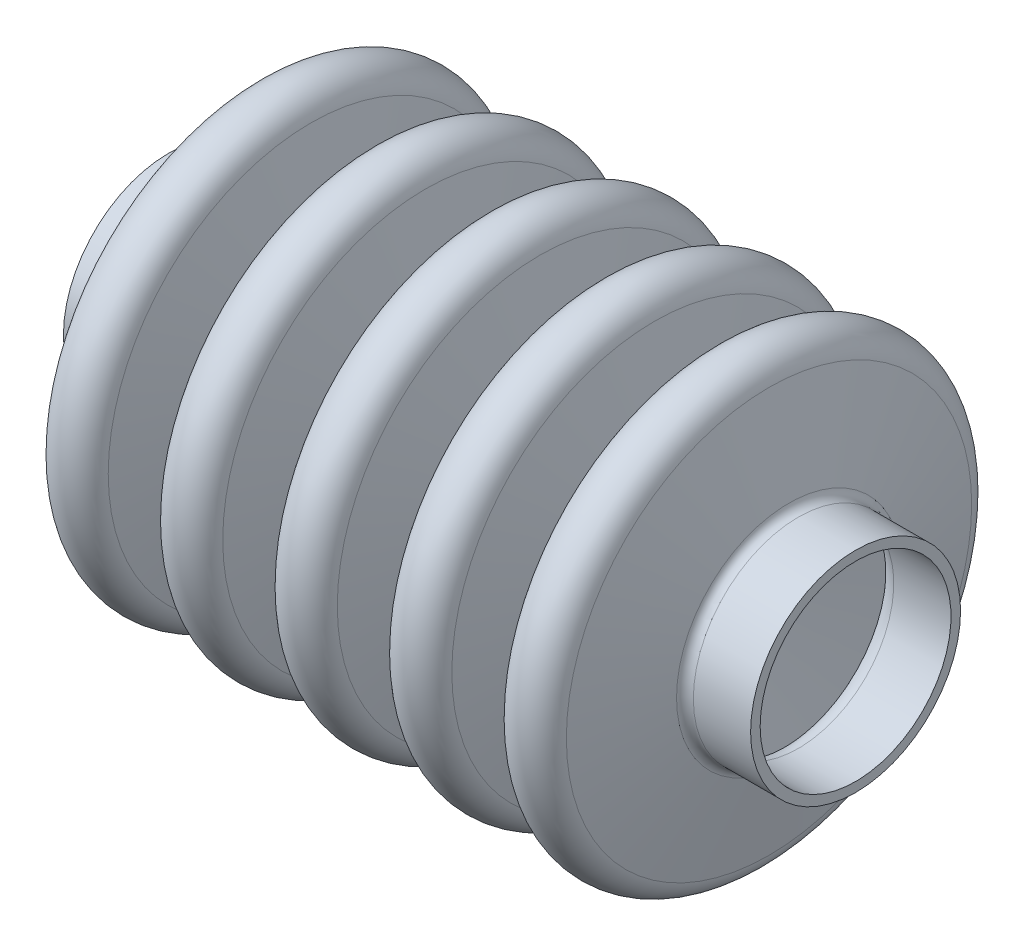
ISO-10303-21;
HEADER;
FILE_DESCRIPTION(('STEP AP214'),'2;1');
FILE_NAME('part.step','',(''),(''),'','','');
FILE_SCHEMA(('AUTOMOTIVE_DESIGN { 1 0 10303 214 1 1 1 1 }'));
ENDSEC;
DATA;
#1=APPLICATION_CONTEXT('core data for automotive mechanical design processes');
#2=APPLICATION_PROTOCOL_DEFINITION('international standard','automotive_design',2000,#1);
#3=PRODUCT_CONTEXT('',#1,'mechanical');
#4=PRODUCT('Part','Part','',(#3));
#5=PRODUCT_RELATED_PRODUCT_CATEGORY('part','',(#4));
#6=PRODUCT_DEFINITION_FORMATION('','',#4);
#7=PRODUCT_DEFINITION_CONTEXT('part definition',#1,'design');
#8=PRODUCT_DEFINITION('design','',#6,#7);
#9=PRODUCT_DEFINITION_SHAPE('','',#8);
#10=(LENGTH_UNIT() NAMED_UNIT(*) SI_UNIT(.MILLI.,.METRE.));
#11=(NAMED_UNIT(*) PLANE_ANGLE_UNIT() SI_UNIT($,.RADIAN.));
#12=(NAMED_UNIT(*) SI_UNIT($,.STERADIAN.) SOLID_ANGLE_UNIT());
#13=UNCERTAINTY_MEASURE_WITH_UNIT(LENGTH_MEASURE(1.E-05),#10,'distance_accuracy_value','');
#14=(GEOMETRIC_REPRESENTATION_CONTEXT(3) GLOBAL_UNCERTAINTY_ASSIGNED_CONTEXT((#13)) GLOBAL_UNIT_ASSIGNED_CONTEXT((#10,
#11,#12)) REPRESENTATION_CONTEXT('',''));
#15=CARTESIAN_POINT('',(0.,0.,0.));
#16=DIRECTION('',(0.,0.,1.));
#17=DIRECTION('',(1.,0.,0.));
#18=AXIS2_PLACEMENT_3D('',#15,#16,#17);
#19=CARTESIAN_POINT('',(-31.9525920142399,0.,0.));
#20=DIRECTION('',(-1.,0.,0.));
#21=DIRECTION('',(0.,0.,1.));
#22=AXIS2_PLACEMENT_3D('',#19,#20,#21);
#23=CONICAL_SURFACE('',#22,11.5671207721238,1.3526301702956);
#24=CARTESIAN_POINT('',(-34.0474079857601,0.,0.));
#25=DIRECTION('',(-1.,0.,0.));
#26=DIRECTION('',(0.,0.,1.));
#27=AXIS2_PLACEMENT_3D('',#24,#25,#26);
#28=CIRCLE('',#27,21.0162249884673);
#29=CARTESIAN_POINT('',(-34.0474079857601,0.,21.0162249884673));
#30=VERTEX_POINT('',#29);
#31=EDGE_CURVE('E123',#30,#30,#28,.T.);
#32=ORIENTED_EDGE('',*,*,#31,.T.);
#33=EDGE_LOOP('',(#32));
#34=FACE_BOUND('',#33,.T.);
#35=CARTESIAN_POINT('',(-31.9525920142399,0.,0.));
#36=DIRECTION('',(-1.,0.,0.));
#37=DIRECTION('',(0.,0.,1.));
#38=AXIS2_PLACEMENT_3D('',#35,#36,#37);
#39=CIRCLE('',#38,11.5671207721238);
#40=CARTESIAN_POINT('',(-31.9525920142399,0.,11.5671207721238));
#41=VERTEX_POINT('',#40);
#42=EDGE_CURVE('E127',#41,#41,#39,.T.);
#43=ORIENTED_EDGE('',*,*,#42,.F.);
#44=EDGE_LOOP('',(#43));
#45=FACE_BOUND('',#44,.T.);
#46=ADVANCED_FACE('F43',(#34,#45),#23,.F.);
#47=CARTESIAN_POINT('',(-30.,0.,0.));
#48=DIRECTION('',(-1.,0.,0.));
#49=DIRECTION('',(0.,0.,1.));
#50=AXIS2_PLACEMENT_3D('',#47,#48,#49);
#51=TOROIDAL_SURFACE('',#50,12.,2.);
#52=ORIENTED_EDGE('',*,*,#42,.T.);
#53=EDGE_LOOP('',(#52));
#54=FACE_BOUND('',#53,.T.);
#55=CARTESIAN_POINT('',(-28.0474079857601,0.,0.));
#56=DIRECTION('',(-1.,0.,0.));
#57=DIRECTION('',(0.,0.,1.));
#58=AXIS2_PLACEMENT_3D('',#55,#56,#57);
#59=CIRCLE('',#58,11.5671207721238);
#60=CARTESIAN_POINT('',(-28.0474079857601,0.,11.5671207721238));
#61=VERTEX_POINT('',#60);
#62=EDGE_CURVE('E131',#61,#61,#59,.T.);
#63=ORIENTED_EDGE('',*,*,#62,.F.);
#64=EDGE_LOOP('',(#63));
#65=FACE_BOUND('',#64,.T.);
#66=ADVANCED_FACE('F262',(#54,#65),#51,.T.);
#67=CARTESIAN_POINT('',(-41.0237039928801,0.,0.));
#68=DIRECTION('',(1.,0.,0.));
#69=DIRECTION('',(0.,0.,-1.));
#70=AXIS2_PLACEMENT_3D('',#67,#68,#69);
#71=CONICAL_SURFACE('',#70,11.7835603860619,1.3526301702956);
#72=CARTESIAN_POINT('',(-38.9288880213598,0.,0.));
#73=DIRECTION('',(-1.,0.,0.));
#74=DIRECTION('',(0.,0.,1.));
#75=AXIS2_PLACEMENT_3D('',#72,#73,#74);
#76=CIRCLE('',#75,21.2326646024054);
#77=CARTESIAN_POINT('',(-38.9288880213598,0.,21.2326646024054));
#78=VERTEX_POINT('',#77);
#79=EDGE_CURVE('E219',#78,#78,#76,.T.);
#80=ORIENTED_EDGE('',*,*,#79,.T.);
#81=EDGE_LOOP('',(#80));
#82=FACE_BOUND('',#81,.T.);
#83=CARTESIAN_POINT('',(-41.0237039928801,0.,0.));
#84=DIRECTION('',(-1.,0.,0.));
#85=DIRECTION('',(0.,0.,1.));
#86=AXIS2_PLACEMENT_3D('',#83,#84,#85);
#87=CIRCLE('',#86,11.7835603860619);
#88=CARTESIAN_POINT('',(-41.0237039928801,0.,11.7835603860619));
#89=VERTEX_POINT('',#88);
#90=EDGE_CURVE('E223',#89,#89,#87,.T.);
#91=ORIENTED_EDGE('',*,*,#90,.F.);
#92=EDGE_LOOP('',(#91));
#93=FACE_BOUND('',#92,.T.);
#94=ADVANCED_FACE('F259',(#82,#93),#71,.T.);
#95=CARTESIAN_POINT('',(-36.,0.,0.));
#96=DIRECTION('',(-1.,0.,0.));
#97=DIRECTION('',(0.,0.,1.));
#98=AXIS2_PLACEMENT_3D('',#95,#96,#97);
#99=TOROIDAL_SURFACE('',#98,20.5833457605911,3.);
#100=ORIENTED_EDGE('',*,*,#79,.F.);
#101=EDGE_LOOP('',(#100));
#102=FACE_BOUND('',#101,.T.);
#103=CARTESIAN_POINT('',(-33.0711119786402,0.,0.));
#104=DIRECTION('',(-1.,0.,0.));
#105=DIRECTION('',(0.,0.,1.));
#106=AXIS2_PLACEMENT_3D('',#103,#104,#105);
#107=CIRCLE('',#106,21.2326646024054);
#108=CARTESIAN_POINT('',(-33.0711119786402,0.,21.2326646024054));
#109=VERTEX_POINT('',#108);
#110=EDGE_CURVE('E215',#109,#109,#107,.T.);
#111=ORIENTED_EDGE('',*,*,#110,.T.);
#112=EDGE_LOOP('',(#111));
#113=FACE_BOUND('',#112,.T.);
#114=ADVANCED_FACE('F261',(#102,#113),#99,.T.);
#115=CARTESIAN_POINT('',(-30.9762960071199,0.,0.));
#116=DIRECTION('',(-1.,0.,0.));
#117=DIRECTION('',(0.,0.,1.));
#118=AXIS2_PLACEMENT_3D('',#115,#116,#117);
#119=CONICAL_SURFACE('',#118,11.7835603860619,1.3526301702956);
#120=ORIENTED_EDGE('',*,*,#110,.F.);
#121=EDGE_LOOP('',(#120));
#122=FACE_BOUND('',#121,.T.);
#123=CARTESIAN_POINT('',(-30.9762960071199,0.,0.));
#124=DIRECTION('',(-1.,0.,0.));
#125=DIRECTION('',(0.,0.,1.));
#126=AXIS2_PLACEMENT_3D('',#123,#124,#125);
#127=CIRCLE('',#126,11.7835603860619);
#128=CARTESIAN_POINT('',(-30.9762960071199,0.,11.7835603860619));
#129=VERTEX_POINT('',#128);
#130=EDGE_CURVE('E211',#129,#129,#127,.T.);
#131=ORIENTED_EDGE('',*,*,#130,.T.);
#132=EDGE_LOOP('',(#131));
#133=FACE_BOUND('',#132,.T.);
#134=ADVANCED_FACE('F270',(#122,#133),#119,.T.);
#135=CARTESIAN_POINT('',(-30.,0.,0.));
#136=DIRECTION('',(-1.,0.,0.));
#137=DIRECTION('',(0.,0.,1.));
#138=AXIS2_PLACEMENT_3D('',#135,#136,#137);
#139=TOROIDAL_SURFACE('',#138,12.,0.999999999999998);
#140=ORIENTED_EDGE('',*,*,#130,.F.);
#141=EDGE_LOOP('',(#140));
#142=FACE_BOUND('',#141,.T.);
#143=CARTESIAN_POINT('',(-29.0237039928801,0.,0.));
#144=DIRECTION('',(-1.,0.,0.));
#145=DIRECTION('',(0.,0.,1.));
#146=AXIS2_PLACEMENT_3D('',#143,#144,#145);
#147=CIRCLE('',#146,11.7835603860619);
#148=CARTESIAN_POINT('',(-29.0237039928801,0.,11.7835603860619));
#149=VERTEX_POINT('',#148);
#150=EDGE_CURVE('E207',#149,#149,#147,.T.);
#151=ORIENTED_EDGE('',*,*,#150,.T.);
#152=EDGE_LOOP('',(#151));
#153=FACE_BOUND('',#152,.T.);
#154=ADVANCED_FACE('F475',(#142,#153),#139,.F.);
#155=CARTESIAN_POINT('',(-36.,0.,0.));
#156=DIRECTION('',(-1.,0.,0.));
#157=DIRECTION('',(0.,0.,1.));
#158=AXIS2_PLACEMENT_3D('',#155,#156,#157);
#159=TOROIDAL_SURFACE('',#158,20.5833457605911,2.);
#160=CARTESIAN_POINT('',(-37.9525920142399,0.,0.));
#161=DIRECTION('',(-1.,0.,0.));
#162=DIRECTION('',(0.,0.,1.));
#163=AXIS2_PLACEMENT_3D('',#160,#161,#162);
#164=CIRCLE('',#163,21.0162249884673);
#165=CARTESIAN_POINT('',(-37.9525920142399,0.,21.0162249884673));
#166=VERTEX_POINT('',#165);
#167=EDGE_CURVE('E119',#166,#166,#164,.T.);
#168=ORIENTED_EDGE('',*,*,#167,.T.);
#169=EDGE_LOOP('',(#168));
#170=FACE_BOUND('',#169,.T.);
#171=ORIENTED_EDGE('',*,*,#31,.F.);
#172=EDGE_LOOP('',(#171));
#173=FACE_BOUND('',#172,.T.);
#174=ADVANCED_FACE('F291',(#170,#173),#159,.F.);
#175=CARTESIAN_POINT('',(-40.0474079857601,0.,0.));
#176=DIRECTION('',(1.,0.,0.));
#177=DIRECTION('',(0.,0.,-1.));
#178=AXIS2_PLACEMENT_3D('',#175,#176,#177);
#179=CONICAL_SURFACE('',#178,11.5671207721238,1.3526301702956);
#180=ORIENTED_EDGE('',*,*,#167,.F.);
#181=EDGE_LOOP('',(#180));
#182=FACE_BOUND('',#181,.T.);
#183=CARTESIAN_POINT('',(-40.0474079857601,0.,0.));
#184=DIRECTION('',(-1.,0.,0.));
#185=DIRECTION('',(0.,0.,1.));
#186=AXIS2_PLACEMENT_3D('',#183,#184,#185);
#187=CIRCLE('',#186,11.5671207721238);
#188=CARTESIAN_POINT('',(-40.0474079857601,0.,11.5671207721238));
#189=VERTEX_POINT('',#188);
#190=EDGE_CURVE('E115',#189,#189,#187,.T.);
#191=ORIENTED_EDGE('',*,*,#190,.T.);
#192=EDGE_LOOP('',(#191));
#193=FACE_BOUND('',#192,.T.);
#194=ADVANCED_FACE('F281',(#182,#193),#179,.F.);
#195=CARTESIAN_POINT('',(-72.,0.,0.));
#196=DIRECTION('',(-1.,0.,0.));
#197=DIRECTION('',(0.,0.,1.));
#198=AXIS2_PLACEMENT_3D('',#195,#196,#197);
#199=PLANE('',#198);
#200=CARTESIAN_POINT('',(-72.,0.,0.));
#201=DIRECTION('',(-1.,0.,0.));
#202=DIRECTION('',(0.,0.,1.));
#203=AXIS2_PLACEMENT_3D('',#200,#201,#202);
#204=CIRCLE('',#203,11.);
#205=CARTESIAN_POINT('',(-72.,0.,11.));
#206=VERTEX_POINT('',#205);
#207=EDGE_CURVE('E71',#206,#206,#204,.T.);
#208=ORIENTED_EDGE('',*,*,#207,.T.);
#209=EDGE_LOOP('',(#208));
#210=FACE_BOUND('',#209,.T.);
#211=CARTESIAN_POINT('',(-72.,0.,0.));
#212=DIRECTION('',(-1.,0.,0.));
#213=DIRECTION('',(0.,0.,1.));
#214=AXIS2_PLACEMENT_3D('',#211,#212,#213);
#215=CIRCLE('',#214,9.99999999999999);
#216=CARTESIAN_POINT('',(-72.,0.,9.99999999999999));
#217=VERTEX_POINT('',#216);
#218=EDGE_CURVE('E75',#217,#217,#215,.T.);
#219=ORIENTED_EDGE('',*,*,#218,.F.);
#220=EDGE_LOOP('',(#219));
#221=FACE_BOUND('',#220,.T.);
#222=ADVANCED_FACE('F265',(#210,#221),#199,.T.);
#223=CARTESIAN_POINT('',(0.,0.,0.));
#224=DIRECTION('',(-1.,0.,0.));
#225=DIRECTION('',(0.,0.,1.));
#226=AXIS2_PLACEMENT_3D('',#223,#224,#225);
#227=CYLINDRICAL_SURFACE('',#226,11.);
#228=ORIENTED_EDGE('',*,*,#207,.F.);
#229=EDGE_LOOP('',(#228));
#230=FACE_BOUND('',#229,.T.);
#231=CARTESIAN_POINT('',(-66.,0.,0.));
#232=DIRECTION('',(-1.,0.,0.));
#233=DIRECTION('',(0.,0.,1.));
#234=AXIS2_PLACEMENT_3D('',#231,#232,#233);
#235=CIRCLE('',#234,11.);
#236=CARTESIAN_POINT('',(-66.,0.,11.));
#237=VERTEX_POINT('',#236);
#238=EDGE_CURVE('E67',#237,#237,#235,.T.);
#239=ORIENTED_EDGE('',*,*,#238,.T.);
#240=EDGE_LOOP('',(#239));
#241=FACE_BOUND('',#240,.T.);
#242=ADVANCED_FACE('F280',(#230,#241),#227,.T.);
#243=CARTESIAN_POINT('',(-66.,0.,0.));
#244=DIRECTION('',(-1.,0.,0.));
#245=DIRECTION('',(0.,0.,1.));
#246=AXIS2_PLACEMENT_3D('',#243,#244,#245);
#247=TOROIDAL_SURFACE('',#246,12.,1.00000000000001);
#248=CARTESIAN_POINT('',(-65.0237039928801,0.,0.));
#249=DIRECTION('',(-1.,0.,0.));
#250=DIRECTION('',(0.,0.,1.));
#251=AXIS2_PLACEMENT_3D('',#248,#249,#250);
#252=CIRCLE('',#251,11.7835603860619);
#253=CARTESIAN_POINT('',(-65.0237039928801,0.,11.7835603860619));
#254=VERTEX_POINT('',#253);
#255=EDGE_CURVE('E61',#254,#254,#252,.T.);
#256=ORIENTED_EDGE('',*,*,#255,.T.);
#257=EDGE_LOOP('',(#256));
#258=FACE_BOUND('',#257,.T.);
#259=ORIENTED_EDGE('',*,*,#238,.F.);
#260=EDGE_LOOP('',(#259));
#261=FACE_BOUND('',#260,.T.);
#262=ADVANCED_FACE('F288',(#258,#261),#247,.F.);
#263=CARTESIAN_POINT('',(-65.0237039928801,0.,0.));
#264=DIRECTION('',(1.,0.,0.));
#265=DIRECTION('',(0.,0.,-1.));
#266=AXIS2_PLACEMENT_3D('',#263,#264,#265);
#267=CONICAL_SURFACE('',#266,11.7835603860619,1.3526301702956);
#268=CARTESIAN_POINT('',(-62.9288880213598,0.,0.));
#269=DIRECTION('',(-1.,0.,0.));
#270=DIRECTION('',(0.,0.,1.));
#271=AXIS2_PLACEMENT_3D('',#268,#269,#270);
#272=CIRCLE('',#271,21.2326646024054);
#273=CARTESIAN_POINT('',(-62.9288880213598,0.,21.2326646024054));
#274=VERTEX_POINT('',#273);
#275=EDGE_CURVE('E56',#274,#274,#272,.T.);
#276=ORIENTED_EDGE('',*,*,#275,.T.);
#277=EDGE_LOOP('',(#276));
#278=FACE_BOUND('',#277,.T.);
#279=ORIENTED_EDGE('',*,*,#255,.F.);
#280=EDGE_LOOP('',(#279));
#281=FACE_BOUND('',#280,.T.);
#282=ADVANCED_FACE('F301',(#278,#281),#267,.T.);
#283=CARTESIAN_POINT('',(-60.,0.,0.));
#284=DIRECTION('',(-1.,0.,0.));
#285=DIRECTION('',(0.,0.,1.));
#286=AXIS2_PLACEMENT_3D('',#283,#284,#285);
#287=TOROIDAL_SURFACE('',#286,20.5833457605911,3.);
#288=ORIENTED_EDGE('',*,*,#275,.F.);
#289=EDGE_LOOP('',(#288));
#290=FACE_BOUND('',#289,.T.);
#291=CARTESIAN_POINT('',(-57.0711119786402,0.,0.));
#292=DIRECTION('',(-1.,0.,0.));
#293=DIRECTION('',(0.,0.,1.));
#294=AXIS2_PLACEMENT_3D('',#291,#292,#293);
#295=CIRCLE('',#294,21.2326646024054);
#296=CARTESIAN_POINT('',(-57.0711119786402,0.,21.2326646024054));
#297=VERTEX_POINT('',#296);
#298=EDGE_CURVE('E51',#297,#297,#295,.T.);
#299=ORIENTED_EDGE('',*,*,#298,.T.);
#300=EDGE_LOOP('',(#299));
#301=FACE_BOUND('',#300,.T.);
#302=ADVANCED_FACE('F305',(#290,#301),#287,.T.);
#303=CARTESIAN_POINT('',(-54.9762960071199,0.,0.));
#304=DIRECTION('',(-1.,0.,0.));
#305=DIRECTION('',(0.,0.,1.));
#306=AXIS2_PLACEMENT_3D('',#303,#304,#305);
#307=CONICAL_SURFACE('',#306,11.7835603860619,1.3526301702956);
#308=ORIENTED_EDGE('',*,*,#298,.F.);
#309=EDGE_LOOP('',(#308));
#310=FACE_BOUND('',#309,.T.);
#311=CARTESIAN_POINT('',(-54.9762960071199,0.,0.));
#312=DIRECTION('',(-1.,0.,0.));
#313=DIRECTION('',(0.,0.,1.));
#314=AXIS2_PLACEMENT_3D('',#311,#312,#313);
#315=CIRCLE('',#314,11.7835603860619);
#316=CARTESIAN_POINT('',(-54.9762960071199,0.,11.7835603860619));
#317=VERTEX_POINT('',#316);
#318=EDGE_CURVE('E10',#317,#317,#315,.T.);
#319=ORIENTED_EDGE('',*,*,#318,.T.);
#320=EDGE_LOOP('',(#319));
#321=FACE_BOUND('',#320,.T.);
#322=ADVANCED_FACE('F258',(#310,#321),#307,.T.);
#323=CARTESIAN_POINT('',(-54.,0.,0.));
#324=DIRECTION('',(-1.,0.,0.));
#325=DIRECTION('',(0.,0.,1.));
#326=AXIS2_PLACEMENT_3D('',#323,#324,#325);
#327=TOROIDAL_SURFACE('',#326,12.,1.);
#328=CARTESIAN_POINT('',(-53.0237039928801,0.,0.));
#329=DIRECTION('',(-1.,0.,0.));
#330=DIRECTION('',(0.,0.,1.));
#331=AXIS2_PLACEMENT_3D('',#328,#329,#330);
#332=CIRCLE('',#331,11.7835603860619);
#333=CARTESIAN_POINT('',(-53.0237039928801,0.,11.7835603860619));
#334=VERTEX_POINT('',#333);
#335=EDGE_CURVE('E239',#334,#334,#332,.T.);
#336=ORIENTED_EDGE('',*,*,#335,.T.);
#337=EDGE_LOOP('',(#336));
#338=FACE_BOUND('',#337,.T.);
#339=ORIENTED_EDGE('',*,*,#318,.F.);
#340=EDGE_LOOP('',(#339));
#341=FACE_BOUND('',#340,.T.);
#342=ADVANCED_FACE('F45',(#338,#341),#327,.F.);
#343=CARTESIAN_POINT('',(-53.0237039928801,0.,0.));
#344=DIRECTION('',(1.,0.,0.));
#345=DIRECTION('',(0.,0.,-1.));
#346=AXIS2_PLACEMENT_3D('',#343,#344,#345);
#347=CONICAL_SURFACE('',#346,11.7835603860619,1.35263017029561);
#348=CARTESIAN_POINT('',(-50.9288880213598,0.,0.));
#349=DIRECTION('',(-1.,0.,0.));
#350=DIRECTION('',(0.,0.,1.));
#351=AXIS2_PLACEMENT_3D('',#348,#349,#350);
#352=CIRCLE('',#351,21.2326646024054);
#353=CARTESIAN_POINT('',(-50.9288880213598,0.,21.2326646024054));
#354=VERTEX_POINT('',#353);
#355=EDGE_CURVE('E235',#354,#354,#352,.T.);
#356=ORIENTED_EDGE('',*,*,#355,.T.);
#357=EDGE_LOOP('',(#356));
#358=FACE_BOUND('',#357,.T.);
#359=ORIENTED_EDGE('',*,*,#335,.F.);
#360=EDGE_LOOP('',(#359));
#361=FACE_BOUND('',#360,.T.);
#362=ADVANCED_FACE('F246',(#358,#361),#347,.T.);
#363=CARTESIAN_POINT('',(-48.,0.,0.));
#364=DIRECTION('',(-1.,0.,0.));
#365=DIRECTION('',(0.,0.,1.));
#366=AXIS2_PLACEMENT_3D('',#363,#364,#365);
#367=TOROIDAL_SURFACE('',#366,20.5833457605911,3.);
#368=ORIENTED_EDGE('',*,*,#355,.F.);
#369=EDGE_LOOP('',(#368));
#370=FACE_BOUND('',#369,.T.);
#371=CARTESIAN_POINT('',(-45.0711119786402,0.,0.));
#372=DIRECTION('',(-1.,0.,0.));
#373=DIRECTION('',(0.,0.,1.));
#374=AXIS2_PLACEMENT_3D('',#371,#372,#373);
#375=CIRCLE('',#374,21.2326646024054);
#376=CARTESIAN_POINT('',(-45.0711119786402,0.,21.2326646024054));
#377=VERTEX_POINT('',#376);
#378=EDGE_CURVE('E231',#377,#377,#375,.T.);
#379=ORIENTED_EDGE('',*,*,#378,.T.);
#380=EDGE_LOOP('',(#379));
#381=FACE_BOUND('',#380,.T.);
#382=ADVANCED_FACE('F248',(#370,#381),#367,.T.);
#383=CARTESIAN_POINT('',(-42.9762960071199,0.,0.));
#384=DIRECTION('',(-1.,0.,0.));
#385=DIRECTION('',(0.,0.,1.));
#386=AXIS2_PLACEMENT_3D('',#383,#384,#385);
#387=CONICAL_SURFACE('',#386,11.7835603860619,1.3526301702956);
#388=ORIENTED_EDGE('',*,*,#378,.F.);
#389=EDGE_LOOP('',(#388));
#390=FACE_BOUND('',#389,.T.);
#391=CARTESIAN_POINT('',(-42.9762960071199,0.,0.));
#392=DIRECTION('',(-1.,0.,0.));
#393=DIRECTION('',(0.,0.,1.));
#394=AXIS2_PLACEMENT_3D('',#391,#392,#393);
#395=CIRCLE('',#394,11.7835603860619);
#396=CARTESIAN_POINT('',(-42.9762960071199,0.,11.7835603860619));
#397=VERTEX_POINT('',#396);
#398=EDGE_CURVE('E227',#397,#397,#395,.T.);
#399=ORIENTED_EDGE('',*,*,#398,.T.);
#400=EDGE_LOOP('',(#399));
#401=FACE_BOUND('',#400,.T.);
#402=ADVANCED_FACE('F255',(#390,#401),#387,.T.);
#403=CARTESIAN_POINT('',(-42.,0.,0.));
#404=DIRECTION('',(-1.,0.,0.));
#405=DIRECTION('',(0.,0.,1.));
#406=AXIS2_PLACEMENT_3D('',#403,#404,#405);
#407=TOROIDAL_SURFACE('',#406,12.,1.);
#408=ORIENTED_EDGE('',*,*,#398,.F.);
#409=EDGE_LOOP('',(#408));
#410=FACE_BOUND('',#409,.T.);
#411=ORIENTED_EDGE('',*,*,#90,.T.);
#412=EDGE_LOOP('',(#411));
#413=FACE_BOUND('',#412,.T.);
#414=ADVANCED_FACE('F342',(#410,#413),#407,.F.);
#415=CARTESIAN_POINT('',(0.,0.,0.));
#416=DIRECTION('',(-1.,0.,0.));
#417=DIRECTION('',(0.,0.,1.));
#418=AXIS2_PLACEMENT_3D('',#415,#416,#417);
#419=CYLINDRICAL_SURFACE('',#418,10.);
#420=ORIENTED_EDGE('',*,*,#218,.T.);
#421=EDGE_LOOP('',(#420));
#422=FACE_BOUND('',#421,.T.);
#423=CARTESIAN_POINT('',(-66.,0.,0.));
#424=DIRECTION('',(-1.,0.,0.));
#425=DIRECTION('',(0.,0.,1.));
#426=AXIS2_PLACEMENT_3D('',#423,#424,#425);
#427=CIRCLE('',#426,10.);
#428=CARTESIAN_POINT('',(-66.,0.,10.));
#429=VERTEX_POINT('',#428);
#430=EDGE_CURVE('E79',#429,#429,#427,.T.);
#431=ORIENTED_EDGE('',*,*,#430,.F.);
#432=EDGE_LOOP('',(#431));
#433=FACE_BOUND('',#432,.T.);
#434=ADVANCED_FACE('F296',(#422,#433),#419,.F.);
#435=CARTESIAN_POINT('',(-66.,0.,0.));
#436=DIRECTION('',(-1.,0.,0.));
#437=DIRECTION('',(0.,0.,1.));
#438=AXIS2_PLACEMENT_3D('',#435,#436,#437);
#439=TOROIDAL_SURFACE('',#438,12.,2.);
#440=CARTESIAN_POINT('',(-64.0474079857601,0.,0.));
#441=DIRECTION('',(-1.,0.,0.));
#442=DIRECTION('',(0.,0.,1.));
#443=AXIS2_PLACEMENT_3D('',#440,#441,#442);
#444=CIRCLE('',#443,11.5671207721238);
#445=CARTESIAN_POINT('',(-64.0474079857601,0.,11.5671207721238));
#446=VERTEX_POINT('',#445);
#447=EDGE_CURVE('E83',#446,#446,#444,.T.);
#448=ORIENTED_EDGE('',*,*,#447,.F.);
#449=EDGE_LOOP('',(#448));
#450=FACE_BOUND('',#449,.T.);
#451=ORIENTED_EDGE('',*,*,#430,.T.);
#452=EDGE_LOOP('',(#451));
#453=FACE_BOUND('',#452,.T.);
#454=ADVANCED_FACE('F366',(#450,#453),#439,.T.);
#455=CARTESIAN_POINT('',(-64.0474079857601,0.,0.));
#456=DIRECTION('',(1.,0.,0.));
#457=DIRECTION('',(0.,0.,-1.));
#458=AXIS2_PLACEMENT_3D('',#455,#456,#457);
#459=CONICAL_SURFACE('',#458,11.5671207721238,1.3526301702956);
#460=CARTESIAN_POINT('',(-61.9525920142398,0.,0.));
#461=DIRECTION('',(-1.,0.,0.));
#462=DIRECTION('',(0.,0.,1.));
#463=AXIS2_PLACEMENT_3D('',#460,#461,#462);
#464=CIRCLE('',#463,21.0162249884673);
#465=CARTESIAN_POINT('',(-61.9525920142398,0.,21.0162249884673));
#466=VERTEX_POINT('',#465);
#467=EDGE_CURVE('E87',#466,#466,#464,.T.);
#468=ORIENTED_EDGE('',*,*,#467,.F.);
#469=EDGE_LOOP('',(#468));
#470=FACE_BOUND('',#469,.T.);
#471=ORIENTED_EDGE('',*,*,#447,.T.);
#472=EDGE_LOOP('',(#471));
#473=FACE_BOUND('',#472,.T.);
#474=ADVANCED_FACE('F375',(#470,#473),#459,.F.);
#475=CARTESIAN_POINT('',(-60.,0.,0.));
#476=DIRECTION('',(-1.,0.,0.));
#477=DIRECTION('',(0.,0.,1.));
#478=AXIS2_PLACEMENT_3D('',#475,#476,#477);
#479=TOROIDAL_SURFACE('',#478,20.5833457605911,2.);
#480=ORIENTED_EDGE('',*,*,#467,.T.);
#481=EDGE_LOOP('',(#480));
#482=FACE_BOUND('',#481,.T.);
#483=CARTESIAN_POINT('',(-58.0474079857601,0.,0.));
#484=DIRECTION('',(-1.,0.,0.));
#485=DIRECTION('',(0.,0.,1.));
#486=AXIS2_PLACEMENT_3D('',#483,#484,#485);
#487=CIRCLE('',#486,21.0162249884673);
#488=CARTESIAN_POINT('',(-58.0474079857601,0.,21.0162249884673));
#489=VERTEX_POINT('',#488);
#490=EDGE_CURVE('E91',#489,#489,#487,.T.);
#491=ORIENTED_EDGE('',*,*,#490,.F.);
#492=EDGE_LOOP('',(#491));
#493=FACE_BOUND('',#492,.T.);
#494=ADVANCED_FACE('F384',(#482,#493),#479,.F.);
#495=CARTESIAN_POINT('',(-55.9525920142399,0.,0.));
#496=DIRECTION('',(-1.,0.,0.));
#497=DIRECTION('',(0.,0.,1.));
#498=AXIS2_PLACEMENT_3D('',#495,#496,#497);
#499=CONICAL_SURFACE('',#498,11.5671207721238,1.3526301702956);
#500=ORIENTED_EDGE('',*,*,#490,.T.);
#501=EDGE_LOOP('',(#500));
#502=FACE_BOUND('',#501,.T.);
#503=CARTESIAN_POINT('',(-55.9525920142399,0.,0.));
#504=DIRECTION('',(-1.,0.,0.));
#505=DIRECTION('',(0.,0.,1.));
#506=AXIS2_PLACEMENT_3D('',#503,#504,#505);
#507=CIRCLE('',#506,11.5671207721238);
#508=CARTESIAN_POINT('',(-55.9525920142399,0.,11.5671207721238));
#509=VERTEX_POINT('',#508);
#510=EDGE_CURVE('E95',#509,#509,#507,.T.);
#511=ORIENTED_EDGE('',*,*,#510,.F.);
#512=EDGE_LOOP('',(#511));
#513=FACE_BOUND('',#512,.T.);
#514=ADVANCED_FACE('F394',(#502,#513),#499,.F.);
#515=CARTESIAN_POINT('',(-54.,0.,0.));
#516=DIRECTION('',(-1.,0.,0.));
#517=DIRECTION('',(0.,0.,1.));
#518=AXIS2_PLACEMENT_3D('',#515,#516,#517);
#519=TOROIDAL_SURFACE('',#518,12.,2.);
#520=CARTESIAN_POINT('',(-52.0474079857601,0.,0.));
#521=DIRECTION('',(-1.,0.,0.));
#522=DIRECTION('',(0.,0.,1.));
#523=AXIS2_PLACEMENT_3D('',#520,#521,#522);
#524=CIRCLE('',#523,11.5671207721238);
#525=CARTESIAN_POINT('',(-52.0474079857601,0.,11.5671207721238));
#526=VERTEX_POINT('',#525);
#527=EDGE_CURVE('E99',#526,#526,#524,.T.);
#528=ORIENTED_EDGE('',*,*,#527,.F.);
#529=EDGE_LOOP('',(#528));
#530=FACE_BOUND('',#529,.T.);
#531=ORIENTED_EDGE('',*,*,#510,.T.);
#532=EDGE_LOOP('',(#531));
#533=FACE_BOUND('',#532,.T.);
#534=ADVANCED_FACE('F404',(#530,#533),#519,.T.);
#535=CARTESIAN_POINT('',(-52.0474079857601,0.,0.));
#536=DIRECTION('',(1.,0.,0.));
#537=DIRECTION('',(0.,0.,-1.));
#538=AXIS2_PLACEMENT_3D('',#535,#536,#537);
#539=CONICAL_SURFACE('',#538,11.5671207721238,1.3526301702956);
#540=CARTESIAN_POINT('',(-49.9525920142399,0.,0.));
#541=DIRECTION('',(-1.,0.,0.));
#542=DIRECTION('',(0.,0.,1.));
#543=AXIS2_PLACEMENT_3D('',#540,#541,#542);
#544=CIRCLE('',#543,21.0162249884673);
#545=CARTESIAN_POINT('',(-49.9525920142399,0.,21.0162249884673));
#546=VERTEX_POINT('',#545);
#547=EDGE_CURVE('E103',#546,#546,#544,.T.);
#548=ORIENTED_EDGE('',*,*,#547,.F.);
#549=EDGE_LOOP('',(#548));
#550=FACE_BOUND('',#549,.T.);
#551=ORIENTED_EDGE('',*,*,#527,.T.);
#552=EDGE_LOOP('',(#551));
#553=FACE_BOUND('',#552,.T.);
#554=ADVANCED_FACE('F414',(#550,#553),#539,.F.);
#555=CARTESIAN_POINT('',(-48.,0.,0.));
#556=DIRECTION('',(-1.,0.,0.));
#557=DIRECTION('',(0.,0.,1.));
#558=AXIS2_PLACEMENT_3D('',#555,#556,#557);
#559=TOROIDAL_SURFACE('',#558,20.5833457605911,2.);
#560=ORIENTED_EDGE('',*,*,#547,.T.);
#561=EDGE_LOOP('',(#560));
#562=FACE_BOUND('',#561,.T.);
#563=CARTESIAN_POINT('',(-46.0474079857601,0.,0.));
#564=DIRECTION('',(-1.,0.,0.));
#565=DIRECTION('',(0.,0.,1.));
#566=AXIS2_PLACEMENT_3D('',#563,#564,#565);
#567=CIRCLE('',#566,21.0162249884673);
#568=CARTESIAN_POINT('',(-46.0474079857601,0.,21.0162249884673));
#569=VERTEX_POINT('',#568);
#570=EDGE_CURVE('E107',#569,#569,#567,.T.);
#571=ORIENTED_EDGE('',*,*,#570,.F.);
#572=EDGE_LOOP('',(#571));
#573=FACE_BOUND('',#572,.T.);
#574=ADVANCED_FACE('F427',(#562,#573),#559,.F.);
#575=CARTESIAN_POINT('',(-43.9525920142399,0.,0.));
#576=DIRECTION('',(-1.,0.,0.));
#577=DIRECTION('',(0.,0.,1.));
#578=AXIS2_PLACEMENT_3D('',#575,#576,#577);
#579=CONICAL_SURFACE('',#578,11.5671207721238,1.3526301702956);
#580=ORIENTED_EDGE('',*,*,#570,.T.);
#581=EDGE_LOOP('',(#580));
#582=FACE_BOUND('',#581,.T.);
#583=CARTESIAN_POINT('',(-43.9525920142399,0.,0.));
#584=DIRECTION('',(-1.,0.,0.));
#585=DIRECTION('',(0.,0.,1.));
#586=AXIS2_PLACEMENT_3D('',#583,#584,#585);
#587=CIRCLE('',#586,11.5671207721238);
#588=CARTESIAN_POINT('',(-43.9525920142399,0.,11.5671207721238));
#589=VERTEX_POINT('',#588);
#590=EDGE_CURVE('E111',#589,#589,#587,.T.);
#591=ORIENTED_EDGE('',*,*,#590,.F.);
#592=EDGE_LOOP('',(#591));
#593=FACE_BOUND('',#592,.T.);
#594=ADVANCED_FACE('F437',(#582,#593),#579,.F.);
#595=CARTESIAN_POINT('',(-42.,0.,0.));
#596=DIRECTION('',(-1.,0.,0.));
#597=DIRECTION('',(0.,0.,1.));
#598=AXIS2_PLACEMENT_3D('',#595,#596,#597);
#599=TOROIDAL_SURFACE('',#598,12.,2.);
#600=ORIENTED_EDGE('',*,*,#590,.T.);
#601=EDGE_LOOP('',(#600));
#602=FACE_BOUND('',#601,.T.);
#603=ORIENTED_EDGE('',*,*,#190,.F.);
#604=EDGE_LOOP('',(#603));
#605=FACE_BOUND('',#604,.T.);
#606=ADVANCED_FACE('F273',(#602,#605),#599,.T.);
#607=CARTESIAN_POINT('',(0.,0.,0.));
#608=DIRECTION('',(-1.,0.,0.));
#609=DIRECTION('',(0.,0.,1.));
#610=AXIS2_PLACEMENT_3D('',#607,#608,#609);
#611=PLANE('',#610);
#612=CARTESIAN_POINT('',(0.,0.,0.));
#613=DIRECTION('',(-1.,0.,0.));
#614=DIRECTION('',(0.,0.,1.));
#615=AXIS2_PLACEMENT_3D('',#612,#613,#614);
#616=CIRCLE('',#615,11.);
#617=CARTESIAN_POINT('',(0.,0.,11.));
#618=VERTEX_POINT('',#617);
#619=EDGE_CURVE('E171',#618,#618,#616,.T.);
#620=ORIENTED_EDGE('',*,*,#619,.F.);
#621=EDGE_LOOP('',(#620));
#622=FACE_BOUND('',#621,.T.);
#623=CARTESIAN_POINT('',(0.,0.,0.));
#624=DIRECTION('',(-1.,0.,0.));
#625=DIRECTION('',(0.,0.,1.));
#626=AXIS2_PLACEMENT_3D('',#623,#624,#625);
#627=CIRCLE('',#626,10.);
#628=CARTESIAN_POINT('',(0.,0.,10.));
#629=VERTEX_POINT('',#628);
#630=EDGE_CURVE('E167',#629,#629,#627,.T.);
#631=ORIENTED_EDGE('',*,*,#630,.T.);
#632=EDGE_LOOP('',(#631));
#633=FACE_BOUND('',#632,.T.);
#634=ADVANCED_FACE('F456',(#622,#633),#611,.F.);
#635=CARTESIAN_POINT('',(0.,0.,0.));
#636=DIRECTION('',(-1.,0.,0.));
#637=DIRECTION('',(0.,0.,1.));
#638=AXIS2_PLACEMENT_3D('',#635,#636,#637);
#639=CYLINDRICAL_SURFACE('',#638,11.);
#640=CARTESIAN_POINT('',(-6.,0.,0.));
#641=DIRECTION('',(-1.,0.,0.));
#642=DIRECTION('',(0.,0.,1.));
#643=AXIS2_PLACEMENT_3D('',#640,#641,#642);
#644=CIRCLE('',#643,11.);
#645=CARTESIAN_POINT('',(-6.,0.,11.));
#646=VERTEX_POINT('',#645);
#647=EDGE_CURVE('E175',#646,#646,#644,.T.);
#648=ORIENTED_EDGE('',*,*,#647,.F.);
#649=EDGE_LOOP('',(#648));
#650=FACE_BOUND('',#649,.T.);
#651=ORIENTED_EDGE('',*,*,#619,.T.);
#652=EDGE_LOOP('',(#651));
#653=FACE_BOUND('',#652,.T.);
#654=ADVANCED_FACE('F472',(#650,#653),#639,.T.);
#655=CARTESIAN_POINT('',(-6.,0.,0.));
#656=DIRECTION('',(-1.,0.,0.));
#657=DIRECTION('',(0.,0.,1.));
#658=AXIS2_PLACEMENT_3D('',#655,#656,#657);
#659=TOROIDAL_SURFACE('',#658,12.,1.);
#660=CARTESIAN_POINT('',(-6.97629600711993,0.,0.));
#661=DIRECTION('',(-1.,0.,0.));
#662=DIRECTION('',(0.,0.,1.));
#663=AXIS2_PLACEMENT_3D('',#660,#661,#662);
#664=CIRCLE('',#663,11.7835603860619);
#665=CARTESIAN_POINT('',(-6.97629600711993,0.,11.7835603860619));
#666=VERTEX_POINT('',#665);
#667=EDGE_CURVE('E179',#666,#666,#664,.T.);
#668=ORIENTED_EDGE('',*,*,#667,.F.);
#669=EDGE_LOOP('',(#668));
#670=FACE_BOUND('',#669,.T.);
#671=ORIENTED_EDGE('',*,*,#647,.T.);
#672=EDGE_LOOP('',(#671));
#673=FACE_BOUND('',#672,.T.);
#674=ADVANCED_FACE('F483',(#670,#673),#659,.F.);
#675=CARTESIAN_POINT('',(-6.97629600711993,0.,0.));
#676=DIRECTION('',(-1.,0.,0.));
#677=DIRECTION('',(0.,0.,1.));
#678=AXIS2_PLACEMENT_3D('',#675,#676,#677);
#679=CONICAL_SURFACE('',#678,11.7835603860619,1.3526301702956);
#680=CARTESIAN_POINT('',(-9.0711119786402,0.,0.));
#681=DIRECTION('',(-1.,0.,0.));
#682=DIRECTION('',(0.,0.,1.));
#683=AXIS2_PLACEMENT_3D('',#680,#681,#682);
#684=CIRCLE('',#683,21.2326646024054);
#685=CARTESIAN_POINT('',(-9.0711119786402,0.,21.2326646024054));
#686=VERTEX_POINT('',#685);
#687=EDGE_CURVE('E183',#686,#686,#684,.T.);
#688=ORIENTED_EDGE('',*,*,#687,.F.);
#689=EDGE_LOOP('',(#688));
#690=FACE_BOUND('',#689,.T.);
#691=ORIENTED_EDGE('',*,*,#667,.T.);
#692=EDGE_LOOP('',(#691));
#693=FACE_BOUND('',#692,.T.);
#694=ADVANCED_FACE('F493',(#690,#693),#679,.T.);
#695=CARTESIAN_POINT('',(-12.,0.,0.));
#696=DIRECTION('',(-1.,0.,0.));
#697=DIRECTION('',(0.,0.,1.));
#698=AXIS2_PLACEMENT_3D('',#695,#696,#697);
#699=TOROIDAL_SURFACE('',#698,20.5833457605911,3.);
#700=CARTESIAN_POINT('',(-14.9288880213598,0.,0.));
#701=DIRECTION('',(-1.,0.,0.));
#702=DIRECTION('',(0.,0.,1.));
#703=AXIS2_PLACEMENT_3D('',#700,#701,#702);
#704=CIRCLE('',#703,21.2326646024054);
#705=CARTESIAN_POINT('',(-14.9288880213598,0.,21.2326646024054));
#706=VERTEX_POINT('',#705);
#707=EDGE_CURVE('E187',#706,#706,#704,.T.);
#708=ORIENTED_EDGE('',*,*,#707,.F.);
#709=EDGE_LOOP('',(#708));
#710=FACE_BOUND('',#709,.T.);
#711=ORIENTED_EDGE('',*,*,#687,.T.);
#712=EDGE_LOOP('',(#711));
#713=FACE_BOUND('',#712,.T.);
#714=ADVANCED_FACE('F503',(#710,#713),#699,.T.);
#715=CARTESIAN_POINT('',(-17.0237039928801,0.,0.));
#716=DIRECTION('',(1.,0.,0.));
#717=DIRECTION('',(0.,0.,-1.));
#718=AXIS2_PLACEMENT_3D('',#715,#716,#717);
#719=CONICAL_SURFACE('',#718,11.7835603860619,1.3526301702956);
#720=ORIENTED_EDGE('',*,*,#707,.T.);
#721=EDGE_LOOP('',(#720));
#722=FACE_BOUND('',#721,.T.);
#723=CARTESIAN_POINT('',(-17.0237039928801,0.,0.));
#724=DIRECTION('',(-1.,0.,0.));
#725=DIRECTION('',(0.,0.,1.));
#726=AXIS2_PLACEMENT_3D('',#723,#724,#725);
#727=CIRCLE('',#726,11.7835603860619);
#728=CARTESIAN_POINT('',(-17.0237039928801,0.,11.7835603860619));
#729=VERTEX_POINT('',#728);
#730=EDGE_CURVE('E191',#729,#729,#727,.T.);
#731=ORIENTED_EDGE('',*,*,#730,.F.);
#732=EDGE_LOOP('',(#731));
#733=FACE_BOUND('',#732,.T.);
#734=ADVANCED_FACE('F513',(#722,#733),#719,.T.);
#735=CARTESIAN_POINT('',(-18.,0.,0.));
#736=DIRECTION('',(-1.,0.,0.));
#737=DIRECTION('',(0.,0.,1.));
#738=AXIS2_PLACEMENT_3D('',#735,#736,#737);
#739=TOROIDAL_SURFACE('',#738,12.,1.);
#740=CARTESIAN_POINT('',(-18.9762960071199,0.,0.));
#741=DIRECTION('',(-1.,0.,0.));
#742=DIRECTION('',(0.,0.,1.));
#743=AXIS2_PLACEMENT_3D('',#740,#741,#742);
#744=CIRCLE('',#743,11.7835603860619);
#745=CARTESIAN_POINT('',(-18.9762960071199,0.,11.7835603860619));
#746=VERTEX_POINT('',#745);
#747=EDGE_CURVE('E195',#746,#746,#744,.T.);
#748=ORIENTED_EDGE('',*,*,#747,.F.);
#749=EDGE_LOOP('',(#748));
#750=FACE_BOUND('',#749,.T.);
#751=ORIENTED_EDGE('',*,*,#730,.T.);
#752=EDGE_LOOP('',(#751));
#753=FACE_BOUND('',#752,.T.);
#754=ADVANCED_FACE('F523',(#750,#753),#739,.F.);
#755=CARTESIAN_POINT('',(-18.9762960071199,0.,0.));
#756=DIRECTION('',(-1.,0.,0.));
#757=DIRECTION('',(0.,0.,1.));
#758=AXIS2_PLACEMENT_3D('',#755,#756,#757);
#759=CONICAL_SURFACE('',#758,11.7835603860619,1.3526301702956);
#760=CARTESIAN_POINT('',(-21.0711119786402,0.,0.));
#761=DIRECTION('',(-1.,0.,0.));
#762=DIRECTION('',(0.,0.,1.));
#763=AXIS2_PLACEMENT_3D('',#760,#761,#762);
#764=CIRCLE('',#763,21.2326646024054);
#765=CARTESIAN_POINT('',(-21.0711119786402,0.,21.2326646024054));
#766=VERTEX_POINT('',#765);
#767=EDGE_CURVE('E199',#766,#766,#764,.T.);
#768=ORIENTED_EDGE('',*,*,#767,.F.);
#769=EDGE_LOOP('',(#768));
#770=FACE_BOUND('',#769,.T.);
#771=ORIENTED_EDGE('',*,*,#747,.T.);
#772=EDGE_LOOP('',(#771));
#773=FACE_BOUND('',#772,.T.);
#774=ADVANCED_FACE('F533',(#770,#773),#759,.T.);
#775=CARTESIAN_POINT('',(-24.,0.,0.));
#776=DIRECTION('',(-1.,0.,0.));
#777=DIRECTION('',(0.,0.,1.));
#778=AXIS2_PLACEMENT_3D('',#775,#776,#777);
#779=TOROIDAL_SURFACE('',#778,20.5833457605911,3.);
#780=CARTESIAN_POINT('',(-26.9288880213598,0.,0.));
#781=DIRECTION('',(-1.,0.,0.));
#782=DIRECTION('',(0.,0.,1.));
#783=AXIS2_PLACEMENT_3D('',#780,#781,#782);
#784=CIRCLE('',#783,21.2326646024054);
#785=CARTESIAN_POINT('',(-26.9288880213598,0.,21.2326646024054));
#786=VERTEX_POINT('',#785);
#787=EDGE_CURVE('E203',#786,#786,#784,.T.);
#788=ORIENTED_EDGE('',*,*,#787,.F.);
#789=EDGE_LOOP('',(#788));
#790=FACE_BOUND('',#789,.T.);
#791=ORIENTED_EDGE('',*,*,#767,.T.);
#792=EDGE_LOOP('',(#791));
#793=FACE_BOUND('',#792,.T.);
#794=ADVANCED_FACE('F546',(#790,#793),#779,.T.);
#795=CARTESIAN_POINT('',(-29.0237039928801,0.,0.));
#796=DIRECTION('',(1.,0.,0.));
#797=DIRECTION('',(0.,0.,-1.));
#798=AXIS2_PLACEMENT_3D('',#795,#796,#797);
#799=CONICAL_SURFACE('',#798,11.7835603860619,1.3526301702956);
#800=ORIENTED_EDGE('',*,*,#787,.T.);
#801=EDGE_LOOP('',(#800));
#802=FACE_BOUND('',#801,.T.);
#803=ORIENTED_EDGE('',*,*,#150,.F.);
#804=EDGE_LOOP('',(#803));
#805=FACE_BOUND('',#804,.T.);
#806=ADVANCED_FACE('F556',(#802,#805),#799,.T.);
#807=CARTESIAN_POINT('',(0.,0.,0.));
#808=DIRECTION('',(-1.,0.,0.));
#809=DIRECTION('',(0.,0.,1.));
#810=AXIS2_PLACEMENT_3D('',#807,#808,#809);
#811=CYLINDRICAL_SURFACE('',#810,10.);
#812=CARTESIAN_POINT('',(-6.,0.,0.));
#813=DIRECTION('',(-1.,0.,0.));
#814=DIRECTION('',(0.,0.,1.));
#815=AXIS2_PLACEMENT_3D('',#812,#813,#814);
#816=CIRCLE('',#815,10.);
#817=CARTESIAN_POINT('',(-6.,0.,10.));
#818=VERTEX_POINT('',#817);
#819=EDGE_CURVE('E163',#818,#818,#816,.T.);
#820=ORIENTED_EDGE('',*,*,#819,.T.);
#821=EDGE_LOOP('',(#820));
#822=FACE_BOUND('',#821,.T.);
#823=ORIENTED_EDGE('',*,*,#630,.F.);
#824=EDGE_LOOP('',(#823));
#825=FACE_BOUND('',#824,.T.);
#826=ADVANCED_FACE('F566',(#822,#825),#811,.F.);
#827=CARTESIAN_POINT('',(-6.,0.,0.));
#828=DIRECTION('',(-1.,0.,0.));
#829=DIRECTION('',(0.,0.,1.));
#830=AXIS2_PLACEMENT_3D('',#827,#828,#829);
#831=TOROIDAL_SURFACE('',#830,12.,2.);
#832=CARTESIAN_POINT('',(-7.95259201423987,0.,0.));
#833=DIRECTION('',(-1.,0.,0.));
#834=DIRECTION('',(0.,0.,1.));
#835=AXIS2_PLACEMENT_3D('',#832,#833,#834);
#836=CIRCLE('',#835,11.5671207721238);
#837=CARTESIAN_POINT('',(-7.95259201423987,0.,11.5671207721238));
#838=VERTEX_POINT('',#837);
#839=EDGE_CURVE('E159',#838,#838,#836,.T.);
#840=ORIENTED_EDGE('',*,*,#839,.T.);
#841=EDGE_LOOP('',(#840));
#842=FACE_BOUND('',#841,.T.);
#843=ORIENTED_EDGE('',*,*,#819,.F.);
#844=EDGE_LOOP('',(#843));
#845=FACE_BOUND('',#844,.T.);
#846=ADVANCED_FACE('F576',(#842,#845),#831,.T.);
#847=CARTESIAN_POINT('',(-7.95259201423987,0.,0.));
#848=DIRECTION('',(-1.,0.,0.));
#849=DIRECTION('',(0.,0.,1.));
#850=AXIS2_PLACEMENT_3D('',#847,#848,#849);
#851=CONICAL_SURFACE('',#850,11.5671207721238,1.3526301702956);
#852=CARTESIAN_POINT('',(-10.0474079857601,0.,0.));
#853=DIRECTION('',(-1.,0.,0.));
#854=DIRECTION('',(0.,0.,1.));
#855=AXIS2_PLACEMENT_3D('',#852,#853,#854);
#856=CIRCLE('',#855,21.0162249884673);
#857=CARTESIAN_POINT('',(-10.0474079857601,0.,21.0162249884673));
#858=VERTEX_POINT('',#857);
#859=EDGE_CURVE('E155',#858,#858,#856,.T.);
#860=ORIENTED_EDGE('',*,*,#859,.T.);
#861=EDGE_LOOP('',(#860));
#862=FACE_BOUND('',#861,.T.);
#863=ORIENTED_EDGE('',*,*,#839,.F.);
#864=EDGE_LOOP('',(#863));
#865=FACE_BOUND('',#864,.T.);
#866=ADVANCED_FACE('F586',(#862,#865),#851,.F.);
#867=CARTESIAN_POINT('',(-12.,0.,0.));
#868=DIRECTION('',(-1.,0.,0.));
#869=DIRECTION('',(0.,0.,1.));
#870=AXIS2_PLACEMENT_3D('',#867,#868,#869);
#871=TOROIDAL_SURFACE('',#870,20.5833457605911,2.);
#872=CARTESIAN_POINT('',(-13.9525920142399,0.,0.));
#873=DIRECTION('',(-1.,0.,0.));
#874=DIRECTION('',(0.,0.,1.));
#875=AXIS2_PLACEMENT_3D('',#872,#873,#874);
#876=CIRCLE('',#875,21.0162249884673);
#877=CARTESIAN_POINT('',(-13.9525920142399,0.,21.0162249884673));
#878=VERTEX_POINT('',#877);
#879=EDGE_CURVE('E151',#878,#878,#876,.T.);
#880=ORIENTED_EDGE('',*,*,#879,.T.);
#881=EDGE_LOOP('',(#880));
#882=FACE_BOUND('',#881,.T.);
#883=ORIENTED_EDGE('',*,*,#859,.F.);
#884=EDGE_LOOP('',(#883));
#885=FACE_BOUND('',#884,.T.);
#886=ADVANCED_FACE('F596',(#882,#885),#871,.F.);
#887=CARTESIAN_POINT('',(-16.0474079857601,0.,0.));
#888=DIRECTION('',(1.,0.,0.));
#889=DIRECTION('',(0.,0.,-1.));
#890=AXIS2_PLACEMENT_3D('',#887,#888,#889);
#891=CONICAL_SURFACE('',#890,11.5671207721238,1.3526301702956);
#892=ORIENTED_EDGE('',*,*,#879,.F.);
#893=EDGE_LOOP('',(#892));
#894=FACE_BOUND('',#893,.T.);
#895=CARTESIAN_POINT('',(-16.0474079857601,0.,0.));
#896=DIRECTION('',(-1.,0.,0.));
#897=DIRECTION('',(0.,0.,1.));
#898=AXIS2_PLACEMENT_3D('',#895,#896,#897);
#899=CIRCLE('',#898,11.5671207721238);
#900=CARTESIAN_POINT('',(-16.0474079857601,0.,11.5671207721238));
#901=VERTEX_POINT('',#900);
#902=EDGE_CURVE('E147',#901,#901,#899,.T.);
#903=ORIENTED_EDGE('',*,*,#902,.T.);
#904=EDGE_LOOP('',(#903));
#905=FACE_BOUND('',#904,.T.);
#906=ADVANCED_FACE('F606',(#894,#905),#891,.F.);
#907=CARTESIAN_POINT('',(-18.,0.,0.));
#908=DIRECTION('',(-1.,0.,0.));
#909=DIRECTION('',(0.,0.,1.));
#910=AXIS2_PLACEMENT_3D('',#907,#908,#909);
#911=TOROIDAL_SURFACE('',#910,12.,2.);
#912=CARTESIAN_POINT('',(-19.9525920142399,0.,0.));
#913=DIRECTION('',(-1.,0.,0.));
#914=DIRECTION('',(0.,0.,1.));
#915=AXIS2_PLACEMENT_3D('',#912,#913,#914);
#916=CIRCLE('',#915,11.5671207721238);
#917=CARTESIAN_POINT('',(-19.9525920142399,0.,11.5671207721238));
#918=VERTEX_POINT('',#917);
#919=EDGE_CURVE('E143',#918,#918,#916,.T.);
#920=ORIENTED_EDGE('',*,*,#919,.T.);
#921=EDGE_LOOP('',(#920));
#922=FACE_BOUND('',#921,.T.);
#923=ORIENTED_EDGE('',*,*,#902,.F.);
#924=EDGE_LOOP('',(#923));
#925=FACE_BOUND('',#924,.T.);
#926=ADVANCED_FACE('F616',(#922,#925),#911,.T.);
#927=CARTESIAN_POINT('',(-19.9525920142399,0.,0.));
#928=DIRECTION('',(-1.,0.,0.));
#929=DIRECTION('',(0.,0.,1.));
#930=AXIS2_PLACEMENT_3D('',#927,#928,#929);
#931=CONICAL_SURFACE('',#930,11.5671207721238,1.3526301702956);
#932=CARTESIAN_POINT('',(-22.0474079857601,0.,0.));
#933=DIRECTION('',(-1.,0.,0.));
#934=DIRECTION('',(0.,0.,1.));
#935=AXIS2_PLACEMENT_3D('',#932,#933,#934);
#936=CIRCLE('',#935,21.0162249884673);
#937=CARTESIAN_POINT('',(-22.0474079857601,0.,21.0162249884673));
#938=VERTEX_POINT('',#937);
#939=EDGE_CURVE('E139',#938,#938,#936,.T.);
#940=ORIENTED_EDGE('',*,*,#939,.T.);
#941=EDGE_LOOP('',(#940));
#942=FACE_BOUND('',#941,.T.);
#943=ORIENTED_EDGE('',*,*,#919,.F.);
#944=EDGE_LOOP('',(#943));
#945=FACE_BOUND('',#944,.T.);
#946=ADVANCED_FACE('F626',(#942,#945),#931,.F.);
#947=CARTESIAN_POINT('',(-24.,0.,0.));
#948=DIRECTION('',(-1.,0.,0.));
#949=DIRECTION('',(0.,0.,1.));
#950=AXIS2_PLACEMENT_3D('',#947,#948,#949);
#951=TOROIDAL_SURFACE('',#950,20.5833457605911,2.);
#952=CARTESIAN_POINT('',(-25.9525920142399,0.,0.));
#953=DIRECTION('',(-1.,0.,0.));
#954=DIRECTION('',(0.,0.,1.));
#955=AXIS2_PLACEMENT_3D('',#952,#953,#954);
#956=CIRCLE('',#955,21.0162249884673);
#957=CARTESIAN_POINT('',(-25.9525920142399,0.,21.0162249884673));
#958=VERTEX_POINT('',#957);
#959=EDGE_CURVE('E135',#958,#958,#956,.T.);
#960=ORIENTED_EDGE('',*,*,#959,.T.);
#961=EDGE_LOOP('',(#960));
#962=FACE_BOUND('',#961,.T.);
#963=ORIENTED_EDGE('',*,*,#939,.F.);
#964=EDGE_LOOP('',(#963));
#965=FACE_BOUND('',#964,.T.);
#966=ADVANCED_FACE('F639',(#962,#965),#951,.F.);
#967=CARTESIAN_POINT('',(-28.0474079857601,0.,0.));
#968=DIRECTION('',(1.,0.,0.));
#969=DIRECTION('',(0.,0.,-1.));
#970=AXIS2_PLACEMENT_3D('',#967,#968,#969);
#971=CONICAL_SURFACE('',#970,11.5671207721238,1.3526301702956);
#972=ORIENTED_EDGE('',*,*,#959,.F.);
#973=EDGE_LOOP('',(#972));
#974=FACE_BOUND('',#973,.T.);
#975=ORIENTED_EDGE('',*,*,#62,.T.);
#976=EDGE_LOOP('',(#975));
#977=FACE_BOUND('',#976,.T.);
#978=ADVANCED_FACE('F276',(#974,#977),#971,.F.);
#979=CLOSED_SHELL('',(#46,#66,#94,#114,#134,#154,#174,#194,#222,#242,#262,#282,#302,#322,#342,
#362,#382,#402,#414,#434,#454,#474,#494,#514,#534,#554,#574,#594,#606,#634,#654,#674,#694,#714,
#734,#754,#774,#794,#806,#826,#846,#866,#886,#906,#926,#946,#966,#978));
#980=MANIFOLD_SOLID_BREP('B2',#979);
#981=ADVANCED_BREP_SHAPE_REPRESENTATION('',(#18,#980),#14);
#982=SHAPE_DEFINITION_REPRESENTATION(#9,#981);
ENDSEC;
END-ISO-10303-21;
